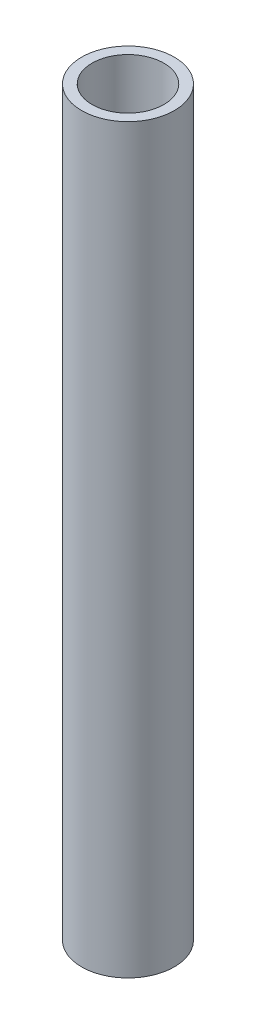
ISO-10303-21;
HEADER;
FILE_DESCRIPTION(('STEP AP214'),'2;1');
FILE_NAME('part.step','',(''),(''),'','','');
FILE_SCHEMA(('AUTOMOTIVE_DESIGN { 1 0 10303 214 1 1 1 1 }'));
ENDSEC;
DATA;
#1=APPLICATION_CONTEXT('core data for automotive mechanical design processes');
#2=APPLICATION_PROTOCOL_DEFINITION('international standard','automotive_design',2000,#1);
#3=PRODUCT_CONTEXT('',#1,'mechanical');
#4=PRODUCT('Part','Part','',(#3));
#5=PRODUCT_RELATED_PRODUCT_CATEGORY('part','',(#4));
#6=PRODUCT_DEFINITION_FORMATION('','',#4);
#7=PRODUCT_DEFINITION_CONTEXT('part definition',#1,'design');
#8=PRODUCT_DEFINITION('design','',#6,#7);
#9=PRODUCT_DEFINITION_SHAPE('','',#8);
#10=(LENGTH_UNIT() NAMED_UNIT(*) SI_UNIT(.MILLI.,.METRE.));
#11=(NAMED_UNIT(*) PLANE_ANGLE_UNIT() SI_UNIT($,.RADIAN.));
#12=(NAMED_UNIT(*) SI_UNIT($,.STERADIAN.) SOLID_ANGLE_UNIT());
#13=UNCERTAINTY_MEASURE_WITH_UNIT(LENGTH_MEASURE(1.E-05),#10,'distance_accuracy_value','');
#14=(GEOMETRIC_REPRESENTATION_CONTEXT(3) GLOBAL_UNCERTAINTY_ASSIGNED_CONTEXT((#13)) GLOBAL_UNIT_ASSIGNED_CONTEXT((#10,
#11,#12)) REPRESENTATION_CONTEXT('',''));
#15=CARTESIAN_POINT('',(0.,0.,0.));
#16=DIRECTION('',(0.,0.,1.));
#17=DIRECTION('',(1.,0.,0.));
#18=AXIS2_PLACEMENT_3D('',#15,#16,#17);
#19=CARTESIAN_POINT('',(0.,101.6,0.));
#20=DIRECTION('',(0.,1.,0.));
#21=DIRECTION('',(0.,0.,1.));
#22=AXIS2_PLACEMENT_3D('',#19,#20,#21);
#23=PLANE('',#22);
#24=CARTESIAN_POINT('',(0.,101.6,0.));
#25=DIRECTION('',(0.,1.,0.));
#26=DIRECTION('',(0.,0.,1.));
#27=AXIS2_PLACEMENT_3D('',#24,#25,#26);
#28=CIRCLE('',#27,6.35);
#29=CARTESIAN_POINT('',(0.,101.6,6.35));
#30=VERTEX_POINT('',#29);
#31=EDGE_CURVE('E10',#30,#30,#28,.T.);
#32=ORIENTED_EDGE('',*,*,#31,.T.);
#33=EDGE_LOOP('',(#32));
#34=FACE_BOUND('',#33,.T.);
#35=CARTESIAN_POINT('',(0.,101.6,0.));
#36=DIRECTION('',(0.,1.,0.));
#37=DIRECTION('',(0.,0.,1.));
#38=AXIS2_PLACEMENT_3D('',#35,#36,#37);
#39=CIRCLE('',#38,4.92125);
#40=CARTESIAN_POINT('',(0.,101.6,4.92125));
#41=VERTEX_POINT('',#40);
#42=EDGE_CURVE('E42',#41,#41,#39,.T.);
#43=ORIENTED_EDGE('',*,*,#42,.F.);
#44=EDGE_LOOP('',(#43));
#45=FACE_BOUND('',#44,.T.);
#46=ADVANCED_FACE('F31',(#34,#45),#23,.T.);
#47=CARTESIAN_POINT('',(0.,0.,0.));
#48=DIRECTION('',(0.,1.,0.));
#49=DIRECTION('',(0.,0.,1.));
#50=AXIS2_PLACEMENT_3D('',#47,#48,#49);
#51=PLANE('',#50);
#52=CARTESIAN_POINT('',(0.,0.,0.));
#53=DIRECTION('',(0.,1.,0.));
#54=DIRECTION('',(0.,0.,1.));
#55=AXIS2_PLACEMENT_3D('',#52,#53,#54);
#56=CIRCLE('',#55,6.35);
#57=CARTESIAN_POINT('',(0.,0.,6.35));
#58=VERTEX_POINT('',#57);
#59=EDGE_CURVE('E35',#58,#58,#56,.T.);
#60=ORIENTED_EDGE('',*,*,#59,.F.);
#61=EDGE_LOOP('',(#60));
#62=FACE_BOUND('',#61,.T.);
#63=CARTESIAN_POINT('',(0.,0.,0.));
#64=DIRECTION('',(0.,1.,0.));
#65=DIRECTION('',(0.,0.,1.));
#66=AXIS2_PLACEMENT_3D('',#63,#64,#65);
#67=CIRCLE('',#66,4.92125);
#68=CARTESIAN_POINT('',(0.,0.,4.92125));
#69=VERTEX_POINT('',#68);
#70=EDGE_CURVE('E44',#69,#69,#67,.T.);
#71=ORIENTED_EDGE('',*,*,#70,.T.);
#72=EDGE_LOOP('',(#71));
#73=FACE_BOUND('',#72,.T.);
#74=ADVANCED_FACE('F54',(#62,#73),#51,.F.);
#75=CARTESIAN_POINT('',(0.,101.6,0.));
#76=DIRECTION('',(0.,-1.,0.));
#77=DIRECTION('',(0.,0.,-1.));
#78=AXIS2_PLACEMENT_3D('',#75,#76,#77);
#79=CYLINDRICAL_SURFACE('',#78,6.35);
#80=ORIENTED_EDGE('',*,*,#31,.F.);
#81=EDGE_LOOP('',(#80));
#82=FACE_BOUND('',#81,.T.);
#83=ORIENTED_EDGE('',*,*,#59,.T.);
#84=EDGE_LOOP('',(#83));
#85=FACE_BOUND('',#84,.T.);
#86=ADVANCED_FACE('F33',(#82,#85),#79,.T.);
#87=CARTESIAN_POINT('',(0.,101.6,0.));
#88=DIRECTION('',(0.,-1.,0.));
#89=DIRECTION('',(0.,0.,-1.));
#90=AXIS2_PLACEMENT_3D('',#87,#88,#89);
#91=CYLINDRICAL_SURFACE('',#90,4.92125);
#92=ORIENTED_EDGE('',*,*,#42,.T.);
#93=EDGE_LOOP('',(#92));
#94=FACE_BOUND('',#93,.T.);
#95=ORIENTED_EDGE('',*,*,#70,.F.);
#96=EDGE_LOOP('',(#95));
#97=FACE_BOUND('',#96,.T.);
#98=ADVANCED_FACE('F50',(#94,#97),#91,.F.);
#99=CLOSED_SHELL('',(#46,#74,#86,#98));
#100=MANIFOLD_SOLID_BREP('B2',#99);
#101=ADVANCED_BREP_SHAPE_REPRESENTATION('',(#18,#100),#14);
#102=SHAPE_DEFINITION_REPRESENTATION(#9,#101);
ENDSEC;
END-ISO-10303-21;
